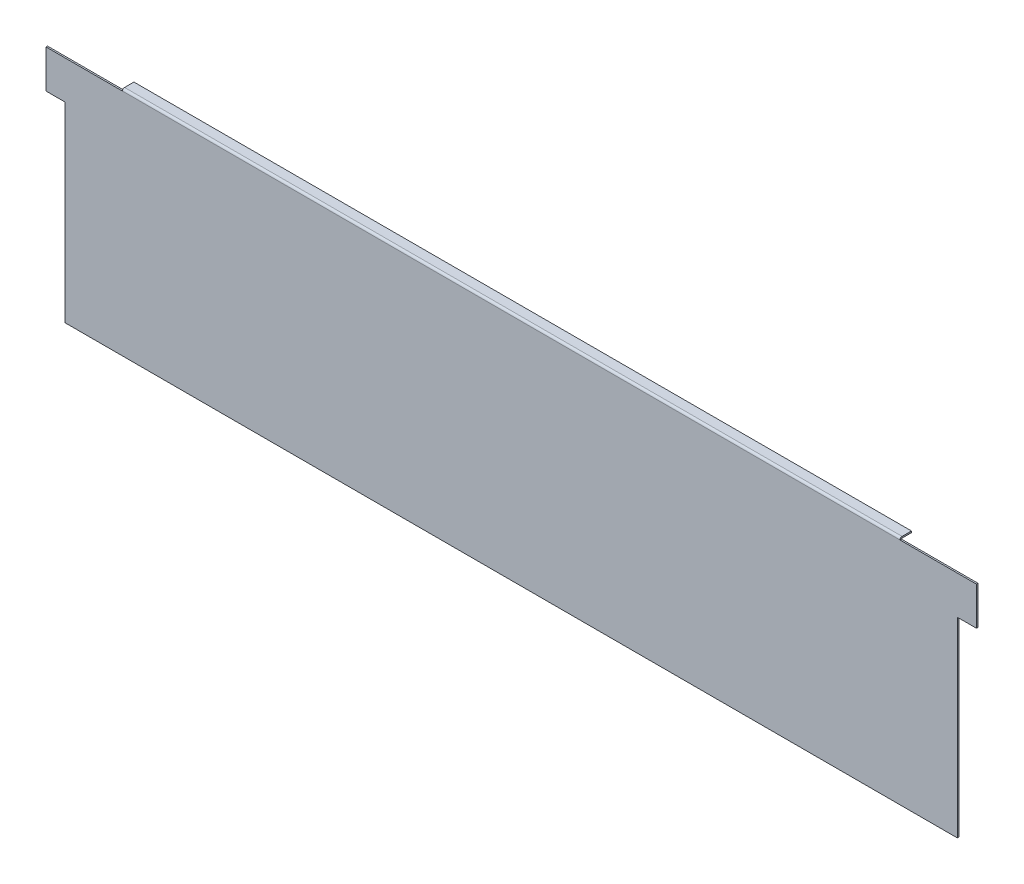
ISO-10303-21;
HEADER;
FILE_DESCRIPTION(('STEP AP214'),'2;1');
FILE_NAME('part.step','',(''),(''),'','','');
FILE_SCHEMA(('AUTOMOTIVE_DESIGN { 1 0 10303 214 1 1 1 1 }'));
ENDSEC;
DATA;
#1=APPLICATION_CONTEXT('core data for automotive mechanical design processes');
#2=APPLICATION_PROTOCOL_DEFINITION('international standard','automotive_design',2000,#1);
#3=PRODUCT_CONTEXT('',#1,'mechanical');
#4=PRODUCT('Part','Part','',(#3));
#5=PRODUCT_RELATED_PRODUCT_CATEGORY('part','',(#4));
#6=PRODUCT_DEFINITION_FORMATION('','',#4);
#7=PRODUCT_DEFINITION_CONTEXT('part definition',#1,'design');
#8=PRODUCT_DEFINITION('design','',#6,#7);
#9=PRODUCT_DEFINITION_SHAPE('','',#8);
#10=(LENGTH_UNIT() NAMED_UNIT(*) SI_UNIT(.MILLI.,.METRE.));
#11=(NAMED_UNIT(*) PLANE_ANGLE_UNIT() SI_UNIT($,.RADIAN.));
#12=(NAMED_UNIT(*) SI_UNIT($,.STERADIAN.) SOLID_ANGLE_UNIT());
#13=UNCERTAINTY_MEASURE_WITH_UNIT(LENGTH_MEASURE(1.E-05),#10,'distance_accuracy_value','');
#14=(GEOMETRIC_REPRESENTATION_CONTEXT(3) GLOBAL_UNCERTAINTY_ASSIGNED_CONTEXT((#13)) GLOBAL_UNIT_ASSIGNED_CONTEXT((#10,
#11,#12)) REPRESENTATION_CONTEXT('',''));
#15=CARTESIAN_POINT('',(0.,0.,0.));
#16=DIRECTION('',(0.,0.,1.));
#17=DIRECTION('',(1.,0.,0.));
#18=AXIS2_PLACEMENT_3D('',#15,#16,#17);
#19=CARTESIAN_POINT('',(-231.583191850594,141.455857385399,-2.));
#20=DIRECTION('',(0.,1.,0.));
#21=DIRECTION('',(0.,0.,1.));
#22=AXIS2_PLACEMENT_3D('',#19,#20,#21);
#23=PLANE('',#22);
#24=DIRECTION('',(-1.,0.,0.));
#25=VECTOR('',#24,1.);
#26=CARTESIAN_POINT('',(-231.583191850594,141.455857385399,-2.));
#27=LINE('',#26,#25);
#28=CARTESIAN_POINT('',(985.416808149406,141.455857385399,-2.));
#29=VERTEX_POINT('',#28);
#30=CARTESIAN_POINT('',(885.416808149406,141.455857385399,-1.99999999999996));
#31=VERTEX_POINT('',#30);
#32=EDGE_CURVE('E171',#29,#31,#27,.T.);
#33=ORIENTED_EDGE('',*,*,#32,.T.);
#34=DIRECTION('',(0.,0.,1.));
#35=VECTOR('',#34,1.);
#36=CARTESIAN_POINT('',(885.416808149406,141.455857385399,-1.99999999999996));
#37=LINE('',#36,#35);
#38=CARTESIAN_POINT('',(885.416808149406,141.455857385399,0.));
#39=VERTEX_POINT('',#38);
#40=EDGE_CURVE('E248',#31,#39,#37,.T.);
#41=ORIENTED_EDGE('',*,*,#40,.T.);
#42=DIRECTION('',(-1.,0.,0.));
#43=VECTOR('',#42,1.);
#44=CARTESIAN_POINT('',(-231.583191850594,141.455857385399,0.));
#45=LINE('',#44,#43);
#46=CARTESIAN_POINT('',(985.416808149406,141.455857385399,0.));
#47=VERTEX_POINT('',#46);
#48=EDGE_CURVE('E199',#47,#39,#45,.T.);
#49=ORIENTED_EDGE('',*,*,#48,.F.);
#50=DIRECTION('',(0.,0.,1.));
#51=VECTOR('',#50,1.);
#52=CARTESIAN_POINT('',(985.416808149406,141.455857385399,-2.));
#53=LINE('',#52,#51);
#54=EDGE_CURVE('E72',#29,#47,#53,.T.);
#55=ORIENTED_EDGE('',*,*,#54,.F.);
#56=EDGE_LOOP('',(#33,#41,#49,#55));
#57=FACE_BOUND('',#56,.T.);
#58=ADVANCED_FACE('F63',(#57),#23,.T.);
#59=CARTESIAN_POINT('',(-231.583191850594,141.455857385399,-2.));
#60=DIRECTION('',(-1.,0.,0.));
#61=DIRECTION('',(0.,-1.,0.));
#62=AXIS2_PLACEMENT_3D('',#59,#60,#61);
#63=PLANE('',#62);
#64=DIRECTION('',(0.,-1.,0.));
#65=VECTOR('',#64,1.);
#66=CARTESIAN_POINT('',(-231.583191850594,141.455857385399,0.));
#67=LINE('',#66,#65);
#68=CARTESIAN_POINT('',(-231.583191850594,141.455857385399,0.));
#69=VERTEX_POINT('',#68);
#70=CARTESIAN_POINT('',(-231.583191850594,91.4558573853989,0.));
#71=VERTEX_POINT('',#70);
#72=EDGE_CURVE('E181',#69,#71,#67,.T.);
#73=ORIENTED_EDGE('',*,*,#72,.F.);
#74=DIRECTION('',(0.,0.,1.));
#75=VECTOR('',#74,1.);
#76=CARTESIAN_POINT('',(-231.583191850594,141.455857385399,-2.));
#77=LINE('',#76,#75);
#78=CARTESIAN_POINT('',(-231.583191850594,141.455857385399,-2.));
#79=VERTEX_POINT('',#78);
#80=EDGE_CURVE('E13',#79,#69,#77,.T.);
#81=ORIENTED_EDGE('',*,*,#80,.F.);
#82=DIRECTION('',(0.,-1.,0.));
#83=VECTOR('',#82,1.);
#84=CARTESIAN_POINT('',(-231.583191850594,141.455857385399,-2.));
#85=LINE('',#84,#83);
#86=CARTESIAN_POINT('',(-231.583191850594,91.4558573853989,-2.));
#87=VERTEX_POINT('',#86);
#88=EDGE_CURVE('E201',#79,#87,#85,.T.);
#89=ORIENTED_EDGE('',*,*,#88,.T.);
#90=DIRECTION('',(0.,0.,1.));
#91=VECTOR('',#90,1.);
#92=CARTESIAN_POINT('',(-231.583191850594,91.4558573853989,-2.));
#93=LINE('',#92,#91);
#94=EDGE_CURVE('E67',#87,#71,#93,.T.);
#95=ORIENTED_EDGE('',*,*,#94,.T.);
#96=EDGE_LOOP('',(#73,#81,#89,#95));
#97=FACE_BOUND('',#96,.T.);
#98=ADVANCED_FACE('F65',(#97),#63,.T.);
#99=DIRECTION('',(0.,0.,1.));
#100=VECTOR('',#99,1.);
#101=CARTESIAN_POINT('',(-131.583191850594,141.455857385399,-1.99999999999996));
#102=LINE('',#101,#100);
#103=CARTESIAN_POINT('',(-131.583191850594,141.455857385399,-1.99999999999996));
#104=VERTEX_POINT('',#103);
#105=CARTESIAN_POINT('',(-131.583191850594,141.455857385399,0.));
#106=VERTEX_POINT('',#105);
#107=EDGE_CURVE('E184',#104,#106,#102,.T.);
#108=ORIENTED_EDGE('',*,*,#107,.F.);
#109=EDGE_CURVE('E88',#104,#79,#27,.T.);
#110=ORIENTED_EDGE('',*,*,#109,.T.);
#111=ORIENTED_EDGE('',*,*,#80,.T.);
#112=EDGE_CURVE('E123',#106,#69,#45,.T.);
#113=ORIENTED_EDGE('',*,*,#112,.F.);
#114=EDGE_LOOP('',(#108,#110,#111,#113));
#115=FACE_BOUND('',#114,.T.);
#116=ADVANCED_FACE('F229',(#115),#23,.T.);
#117=CARTESIAN_POINT('',(985.416808149406,141.455857385399,-2.));
#118=DIRECTION('',(1.,0.,0.));
#119=DIRECTION('',(0.,0.,-1.));
#120=AXIS2_PLACEMENT_3D('',#117,#118,#119);
#121=PLANE('',#120);
#122=DIRECTION('',(0.,1.,0.));
#123=VECTOR('',#122,1.);
#124=CARTESIAN_POINT('',(985.416808149406,141.455857385399,0.));
#125=LINE('',#124,#123);
#126=CARTESIAN_POINT('',(985.416808149406,91.4558573853989,0.));
#127=VERTEX_POINT('',#126);
#128=EDGE_CURVE('E155',#127,#47,#125,.T.);
#129=ORIENTED_EDGE('',*,*,#128,.F.);
#130=DIRECTION('',(0.,0.,1.));
#131=VECTOR('',#130,1.);
#132=CARTESIAN_POINT('',(985.416808149406,91.4558573853989,-2.));
#133=LINE('',#132,#131);
#134=CARTESIAN_POINT('',(985.416808149406,91.4558573853989,-2.));
#135=VERTEX_POINT('',#134);
#136=EDGE_CURVE('E149',#135,#127,#133,.T.);
#137=ORIENTED_EDGE('',*,*,#136,.F.);
#138=DIRECTION('',(0.,1.,0.));
#139=VECTOR('',#138,1.);
#140=CARTESIAN_POINT('',(985.416808149406,141.455857385399,-2.));
#141=LINE('',#140,#139);
#142=EDGE_CURVE('E152',#135,#29,#141,.T.);
#143=ORIENTED_EDGE('',*,*,#142,.T.);
#144=ORIENTED_EDGE('',*,*,#54,.T.);
#145=EDGE_LOOP('',(#129,#137,#143,#144));
#146=FACE_BOUND('',#145,.T.);
#147=ADVANCED_FACE('F151',(#146),#121,.T.);
#148=CARTESIAN_POINT('',(960.416808149406,91.4558573853989,-2.));
#149=DIRECTION('',(0.,-1.,0.));
#150=DIRECTION('',(0.,0.,-1.));
#151=AXIS2_PLACEMENT_3D('',#148,#149,#150);
#152=PLANE('',#151);
#153=DIRECTION('',(1.,0.,0.));
#154=VECTOR('',#153,1.);
#155=CARTESIAN_POINT('',(960.416808149406,91.4558573853989,0.));
#156=LINE('',#155,#154);
#157=CARTESIAN_POINT('',(960.416808149406,91.4558573853989,0.));
#158=VERTEX_POINT('',#157);
#159=EDGE_CURVE('E196',#158,#127,#156,.T.);
#160=ORIENTED_EDGE('',*,*,#159,.F.);
#161=DIRECTION('',(0.,0.,1.));
#162=VECTOR('',#161,1.);
#163=CARTESIAN_POINT('',(960.416808149406,91.4558573853989,-2.));
#164=LINE('',#163,#162);
#165=CARTESIAN_POINT('',(960.416808149406,91.4558573853989,-2.));
#166=VERTEX_POINT('',#165);
#167=EDGE_CURVE('E160',#166,#158,#164,.T.);
#168=ORIENTED_EDGE('',*,*,#167,.F.);
#169=DIRECTION('',(1.,0.,0.));
#170=VECTOR('',#169,1.);
#171=CARTESIAN_POINT('',(960.416808149406,91.4558573853989,-2.));
#172=LINE('',#171,#170);
#173=EDGE_CURVE('E167',#166,#135,#172,.T.);
#174=ORIENTED_EDGE('',*,*,#173,.T.);
#175=ORIENTED_EDGE('',*,*,#136,.T.);
#176=EDGE_LOOP('',(#160,#168,#174,#175));
#177=FACE_BOUND('',#176,.T.);
#178=ADVANCED_FACE('F173',(#177),#152,.T.);
#179=CARTESIAN_POINT('',(960.416808149406,91.4558573853989,-2.));
#180=DIRECTION('',(1.,0.,0.));
#181=DIRECTION('',(0.,1.,0.));
#182=AXIS2_PLACEMENT_3D('',#179,#180,#181);
#183=PLANE('',#182);
#184=DIRECTION('',(0.,1.,0.));
#185=VECTOR('',#184,1.);
#186=CARTESIAN_POINT('',(960.416808149406,91.4558573853989,0.));
#187=LINE('',#186,#185);
#188=CARTESIAN_POINT('',(960.416808149406,-158.544142614601,0.));
#189=VERTEX_POINT('',#188);
#190=EDGE_CURVE('E193',#189,#158,#187,.T.);
#191=ORIENTED_EDGE('',*,*,#190,.F.);
#192=DIRECTION('',(0.,0.,1.));
#193=VECTOR('',#192,1.);
#194=CARTESIAN_POINT('',(960.416808149406,-158.544142614601,-2.));
#195=LINE('',#194,#193);
#196=CARTESIAN_POINT('',(960.416808149406,-158.544142614601,-2.));
#197=VERTEX_POINT('',#196);
#198=EDGE_CURVE('E205',#197,#189,#195,.T.);
#199=ORIENTED_EDGE('',*,*,#198,.F.);
#200=DIRECTION('',(0.,1.,0.));
#201=VECTOR('',#200,1.);
#202=CARTESIAN_POINT('',(960.416808149406,91.4558573853989,-2.));
#203=LINE('',#202,#201);
#204=EDGE_CURVE('E174',#197,#166,#203,.T.);
#205=ORIENTED_EDGE('',*,*,#204,.T.);
#206=ORIENTED_EDGE('',*,*,#167,.T.);
#207=EDGE_LOOP('',(#191,#199,#205,#206));
#208=FACE_BOUND('',#207,.T.);
#209=ADVANCED_FACE('F268',(#208),#183,.T.);
#210=CARTESIAN_POINT('',(-206.583191850594,-158.544142614601,-2.));
#211=DIRECTION('',(0.,-1.,0.));
#212=DIRECTION('',(0.,0.,-1.));
#213=AXIS2_PLACEMENT_3D('',#210,#211,#212);
#214=PLANE('',#213);
#215=DIRECTION('',(1.,0.,0.));
#216=VECTOR('',#215,1.);
#217=CARTESIAN_POINT('',(-206.583191850594,-158.544142614601,0.));
#218=LINE('',#217,#216);
#219=CARTESIAN_POINT('',(-206.583191850594,-158.544142614601,0.));
#220=VERTEX_POINT('',#219);
#221=EDGE_CURVE('E190',#220,#189,#218,.T.);
#222=ORIENTED_EDGE('',*,*,#221,.F.);
#223=DIRECTION('',(0.,0.,1.));
#224=VECTOR('',#223,1.);
#225=CARTESIAN_POINT('',(-206.583191850594,-158.544142614601,-2.));
#226=LINE('',#225,#224);
#227=CARTESIAN_POINT('',(-206.583191850594,-158.544142614601,-2.));
#228=VERTEX_POINT('',#227);
#229=EDGE_CURVE('E207',#228,#220,#226,.T.);
#230=ORIENTED_EDGE('',*,*,#229,.F.);
#231=DIRECTION('',(1.,0.,0.));
#232=VECTOR('',#231,1.);
#233=CARTESIAN_POINT('',(-206.583191850594,-158.544142614601,-2.));
#234=LINE('',#233,#232);
#235=EDGE_CURVE('E176',#228,#197,#234,.T.);
#236=ORIENTED_EDGE('',*,*,#235,.T.);
#237=ORIENTED_EDGE('',*,*,#198,.T.);
#238=EDGE_LOOP('',(#222,#230,#236,#237));
#239=FACE_BOUND('',#238,.T.);
#240=ADVANCED_FACE('F263',(#239),#214,.T.);
#241=CARTESIAN_POINT('',(-206.583191850594,91.4558573853989,-2.));
#242=DIRECTION('',(-1.,0.,0.));
#243=DIRECTION('',(0.,-1.,0.));
#244=AXIS2_PLACEMENT_3D('',#241,#242,#243);
#245=PLANE('',#244);
#246=DIRECTION('',(0.,-1.,0.));
#247=VECTOR('',#246,1.);
#248=CARTESIAN_POINT('',(-206.583191850594,91.4558573853989,0.));
#249=LINE('',#248,#247);
#250=CARTESIAN_POINT('',(-206.583191850594,91.4558573853989,0.));
#251=VERTEX_POINT('',#250);
#252=EDGE_CURVE('E187',#251,#220,#249,.T.);
#253=ORIENTED_EDGE('',*,*,#252,.F.);
#254=DIRECTION('',(0.,0.,1.));
#255=VECTOR('',#254,1.);
#256=CARTESIAN_POINT('',(-206.583191850594,91.4558573853989,-2.));
#257=LINE('',#256,#255);
#258=CARTESIAN_POINT('',(-206.583191850594,91.4558573853989,-2.));
#259=VERTEX_POINT('',#258);
#260=EDGE_CURVE('E208',#259,#251,#257,.T.);
#261=ORIENTED_EDGE('',*,*,#260,.F.);
#262=DIRECTION('',(0.,-1.,0.));
#263=VECTOR('',#262,1.);
#264=CARTESIAN_POINT('',(-206.583191850594,91.4558573853989,-2.));
#265=LINE('',#264,#263);
#266=EDGE_CURVE('E254',#259,#228,#265,.T.);
#267=ORIENTED_EDGE('',*,*,#266,.T.);
#268=ORIENTED_EDGE('',*,*,#229,.T.);
#269=EDGE_LOOP('',(#253,#261,#267,#268));
#270=FACE_BOUND('',#269,.T.);
#271=ADVANCED_FACE('F266',(#270),#245,.T.);
#272=CARTESIAN_POINT('',(-231.583191850594,91.4558573853989,-2.));
#273=DIRECTION('',(0.,-1.,0.));
#274=DIRECTION('',(0.,0.,-1.));
#275=AXIS2_PLACEMENT_3D('',#272,#273,#274);
#276=PLANE('',#275);
#277=DIRECTION('',(1.,0.,0.));
#278=VECTOR('',#277,1.);
#279=CARTESIAN_POINT('',(-231.583191850594,91.4558573853989,0.));
#280=LINE('',#279,#278);
#281=EDGE_CURVE('E183',#71,#251,#280,.T.);
#282=ORIENTED_EDGE('',*,*,#281,.F.);
#283=ORIENTED_EDGE('',*,*,#94,.F.);
#284=DIRECTION('',(1.,0.,0.));
#285=VECTOR('',#284,1.);
#286=CARTESIAN_POINT('',(-231.583191850594,91.4558573853989,-2.));
#287=LINE('',#286,#285);
#288=EDGE_CURVE('E252',#87,#259,#287,.T.);
#289=ORIENTED_EDGE('',*,*,#288,.T.);
#290=ORIENTED_EDGE('',*,*,#260,.T.);
#291=EDGE_LOOP('',(#282,#283,#289,#290));
#292=FACE_BOUND('',#291,.T.);
#293=ADVANCED_FACE('F213',(#292),#276,.T.);
#294=CARTESIAN_POINT('',(0.,0.,-2.));
#295=DIRECTION('',(0.,0.,1.));
#296=DIRECTION('',(1.,0.,0.));
#297=AXIS2_PLACEMENT_3D('',#294,#295,#296);
#298=PLANE('',#297);
#299=ORIENTED_EDGE('',*,*,#88,.F.);
#300=ORIENTED_EDGE('',*,*,#109,.F.);
#301=DIRECTION('',(1.,0.,0.));
#302=VECTOR('',#301,1.);
#303=CARTESIAN_POINT('',(885.416808149406,141.455857385399,-1.99999999999996));
#304=LINE('',#303,#302);
#305=EDGE_CURVE('E250',#31,#104,#304,.F.);
#306=ORIENTED_EDGE('',*,*,#305,.F.);
#307=ORIENTED_EDGE('',*,*,#32,.F.);
#308=ORIENTED_EDGE('',*,*,#142,.F.);
#309=ORIENTED_EDGE('',*,*,#173,.F.);
#310=ORIENTED_EDGE('',*,*,#204,.F.);
#311=ORIENTED_EDGE('',*,*,#235,.F.);
#312=ORIENTED_EDGE('',*,*,#266,.F.);
#313=ORIENTED_EDGE('',*,*,#288,.F.);
#314=EDGE_LOOP('',(#299,#300,#306,#307,#308,#309,#310,#311,#312,#313));
#315=FACE_BOUND('',#314,.T.);
#316=ADVANCED_FACE('F165',(#315),#298,.F.);
#317=CARTESIAN_POINT('',(0.,0.,0.));
#318=DIRECTION('',(0.,0.,1.));
#319=DIRECTION('',(1.,0.,0.));
#320=AXIS2_PLACEMENT_3D('',#317,#318,#319);
#321=PLANE('',#320);
#322=ORIENTED_EDGE('',*,*,#72,.T.);
#323=ORIENTED_EDGE('',*,*,#281,.T.);
#324=ORIENTED_EDGE('',*,*,#252,.T.);
#325=ORIENTED_EDGE('',*,*,#221,.T.);
#326=ORIENTED_EDGE('',*,*,#190,.T.);
#327=ORIENTED_EDGE('',*,*,#159,.T.);
#328=ORIENTED_EDGE('',*,*,#128,.T.);
#329=ORIENTED_EDGE('',*,*,#48,.T.);
#330=DIRECTION('',(1.,0.,0.));
#331=VECTOR('',#330,1.);
#332=CARTESIAN_POINT('',(885.416808149406,141.455857385399,0.));
#333=LINE('',#332,#331);
#334=EDGE_CURVE('E508',#39,#106,#333,.F.);
#335=ORIENTED_EDGE('',*,*,#334,.T.);
#336=ORIENTED_EDGE('',*,*,#112,.T.);
#337=EDGE_LOOP('',(#322,#323,#324,#325,#326,#327,#328,#329,#335,#336));
#338=FACE_BOUND('',#337,.T.);
#339=ADVANCED_FACE('F214',(#338),#321,.T.);
#340=CARTESIAN_POINT('',(-131.583191850594,141.455857385399,-2.73659999999997));
#341=DIRECTION('',(-1.,0.,0.));
#342=DIRECTION('',(0.,0.,1.));
#343=AXIS2_PLACEMENT_3D('',#340,#341,#342);
#344=PLANE('',#343);
#345=DIRECTION('',(0.,-1.,0.));
#346=VECTOR('',#345,1.);
#347=CARTESIAN_POINT('',(-131.583191850594,144.192457385399,-2.73659999999991));
#348=LINE('',#347,#346);
#349=CARTESIAN_POINT('',(-131.583191850594,142.192457385399,-2.73659999999996));
#350=VERTEX_POINT('',#349);
#351=CARTESIAN_POINT('',(-131.583191850594,144.192457385399,-2.73659999999996));
#352=VERTEX_POINT('',#351);
#353=EDGE_CURVE('E506',#350,#352,#348,.F.);
#354=ORIENTED_EDGE('',*,*,#353,.F.);
#355=CARTESIAN_POINT('',(-131.583191850594,141.455857385399,-2.73659999999997));
#356=DIRECTION('',(1.,0.,0.));
#357=DIRECTION('',(0.,0.,-1.));
#358=AXIS2_PLACEMENT_3D('',#355,#356,#357);
#359=CIRCLE('',#358,0.736600000000004);
#360=EDGE_CURVE('E513',#104,#350,#359,.F.);
#361=ORIENTED_EDGE('',*,*,#360,.F.);
#362=ORIENTED_EDGE('',*,*,#107,.T.);
#363=CARTESIAN_POINT('',(-131.583191850594,141.455857385399,-2.73659999999997));
#364=DIRECTION('',(1.,0.,0.));
#365=DIRECTION('',(0.,0.,-1.));
#366=AXIS2_PLACEMENT_3D('',#363,#364,#365);
#367=CIRCLE('',#366,2.7366);
#368=EDGE_CURVE('E510',#106,#352,#367,.F.);
#369=ORIENTED_EDGE('',*,*,#368,.T.);
#370=EDGE_LOOP('',(#354,#361,#362,#369));
#371=FACE_BOUND('',#370,.T.);
#372=ADVANCED_FACE('F216',(#371),#344,.T.);
#373=CARTESIAN_POINT('',(885.416808149406,141.455857385399,-2.73659999999997));
#374=DIRECTION('',(-1.,0.,0.));
#375=DIRECTION('',(0.,0.,1.));
#376=AXIS2_PLACEMENT_3D('',#373,#374,#375);
#377=PLANE('',#376);
#378=CARTESIAN_POINT('',(885.416808149406,141.455857385399,-2.73659999999997));
#379=DIRECTION('',(1.,0.,0.));
#380=DIRECTION('',(0.,0.,-1.));
#381=AXIS2_PLACEMENT_3D('',#378,#379,#380);
#382=CIRCLE('',#381,0.736600000000004);
#383=CARTESIAN_POINT('',(885.416808149406,142.192457385399,-2.73659999999996));
#384=VERTEX_POINT('',#383);
#385=EDGE_CURVE('E517',#384,#31,#382,.T.);
#386=ORIENTED_EDGE('',*,*,#385,.F.);
#387=DIRECTION('',(0.,-1.,0.));
#388=VECTOR('',#387,1.);
#389=CARTESIAN_POINT('',(885.416808149406,142.192457385399,-2.73660000000001));
#390=LINE('',#389,#388);
#391=CARTESIAN_POINT('',(885.416808149406,144.192457385399,-2.7366));
#392=VERTEX_POINT('',#391);
#393=EDGE_CURVE('E503',#384,#392,#390,.F.);
#394=ORIENTED_EDGE('',*,*,#393,.T.);
#395=CARTESIAN_POINT('',(885.416808149406,141.455857385399,-2.73659999999997));
#396=DIRECTION('',(1.,0.,0.));
#397=DIRECTION('',(0.,0.,-1.));
#398=AXIS2_PLACEMENT_3D('',#395,#396,#397);
#399=CIRCLE('',#398,2.7366);
#400=EDGE_CURVE('E80',#392,#39,#399,.T.);
#401=ORIENTED_EDGE('',*,*,#400,.T.);
#402=ORIENTED_EDGE('',*,*,#40,.F.);
#403=EDGE_LOOP('',(#386,#394,#401,#402));
#404=FACE_BOUND('',#403,.T.);
#405=ADVANCED_FACE('F222',(#404),#377,.F.);
#406=CARTESIAN_POINT('',(885.416808149406,141.455857385399,-2.73659999999997));
#407=DIRECTION('',(1.,0.,0.));
#408=DIRECTION('',(0.,1.,0.));
#409=AXIS2_PLACEMENT_3D('',#406,#407,#408);
#410=CYLINDRICAL_SURFACE('',#409,2.7366);
#411=ORIENTED_EDGE('',*,*,#334,.F.);
#412=ORIENTED_EDGE('',*,*,#400,.F.);
#413=DIRECTION('',(1.,0.,0.));
#414=VECTOR('',#413,1.);
#415=CARTESIAN_POINT('',(-131.583191850594,144.192457385399,-2.73659999999991));
#416=LINE('',#415,#414);
#417=EDGE_CURVE('E500',#392,#352,#416,.F.);
#418=ORIENTED_EDGE('',*,*,#417,.T.);
#419=ORIENTED_EDGE('',*,*,#368,.F.);
#420=EDGE_LOOP('',(#411,#412,#418,#419));
#421=FACE_BOUND('',#420,.T.);
#422=ADVANCED_FACE('F362',(#421),#410,.T.);
#423=CARTESIAN_POINT('',(885.416808149406,141.455857385399,-2.73659999999997));
#424=DIRECTION('',(1.,0.,0.));
#425=DIRECTION('',(0.,1.,0.));
#426=AXIS2_PLACEMENT_3D('',#423,#424,#425);
#427=CYLINDRICAL_SURFACE('',#426,0.736600000000004);
#428=ORIENTED_EDGE('',*,*,#305,.T.);
#429=ORIENTED_EDGE('',*,*,#360,.T.);
#430=DIRECTION('',(1.,0.,0.));
#431=VECTOR('',#430,1.);
#432=CARTESIAN_POINT('',(-131.583191850594,142.192457385399,-2.73659999999992));
#433=LINE('',#432,#431);
#434=EDGE_CURVE('E490',#350,#384,#433,.T.);
#435=ORIENTED_EDGE('',*,*,#434,.T.);
#436=ORIENTED_EDGE('',*,*,#385,.T.);
#437=EDGE_LOOP('',(#428,#429,#435,#436));
#438=FACE_BOUND('',#437,.T.);
#439=ADVANCED_FACE('F370',(#438),#427,.F.);
#440=CARTESIAN_POINT('',(885.416808149406,144.192457385399,-15.));
#441=DIRECTION('',(-1.,0.,0.));
#442=DIRECTION('',(0.,0.,1.));
#443=AXIS2_PLACEMENT_3D('',#440,#441,#442);
#444=PLANE('',#443);
#445=ORIENTED_EDGE('',*,*,#393,.F.);
#446=DIRECTION('',(0.,0.,1.));
#447=VECTOR('',#446,1.);
#448=CARTESIAN_POINT('',(885.416808149406,142.192457385399,-15.));
#449=LINE('',#448,#447);
#450=CARTESIAN_POINT('',(885.416808149406,142.192457385399,-15.));
#451=VERTEX_POINT('',#450);
#452=EDGE_CURVE('E480',#384,#451,#449,.F.);
#453=ORIENTED_EDGE('',*,*,#452,.T.);
#454=DIRECTION('',(0.,-1.,0.));
#455=VECTOR('',#454,1.);
#456=CARTESIAN_POINT('',(885.416808149406,144.192457385399,-15.));
#457=LINE('',#456,#455);
#458=CARTESIAN_POINT('',(885.416808149406,144.192457385399,-15.));
#459=VERTEX_POINT('',#458);
#460=EDGE_CURVE('E474',#459,#451,#457,.T.);
#461=ORIENTED_EDGE('',*,*,#460,.F.);
#462=DIRECTION('',(0.,0.,-1.));
#463=VECTOR('',#462,1.);
#464=CARTESIAN_POINT('',(885.416808149406,144.192457385399,6.11012000513692E-13));
#465=LINE('',#464,#463);
#466=EDGE_CURVE('E491',#392,#459,#465,.T.);
#467=ORIENTED_EDGE('',*,*,#466,.F.);
#468=EDGE_LOOP('',(#445,#453,#461,#467));
#469=FACE_BOUND('',#468,.T.);
#470=ADVANCED_FACE('F379',(#469),#444,.F.);
#471=CARTESIAN_POINT('',(-131.583191850594,144.192457385399,-1.99999999999992));
#472=DIRECTION('',(1.,0.,0.));
#473=DIRECTION('',(0.,0.,-1.));
#474=AXIS2_PLACEMENT_3D('',#471,#472,#473);
#475=PLANE('',#474);
#476=ORIENTED_EDGE('',*,*,#353,.T.);
#477=DIRECTION('',(0.,0.,1.));
#478=VECTOR('',#477,1.);
#479=CARTESIAN_POINT('',(-131.583191850594,144.192457385399,0.));
#480=LINE('',#479,#478);
#481=CARTESIAN_POINT('',(-131.583191850594,144.192457385399,-15.));
#482=VERTEX_POINT('',#481);
#483=EDGE_CURVE('E486',#482,#352,#480,.T.);
#484=ORIENTED_EDGE('',*,*,#483,.F.);
#485=DIRECTION('',(0.,-1.,0.));
#486=VECTOR('',#485,1.);
#487=CARTESIAN_POINT('',(-131.583191850594,144.192457385399,-15.));
#488=LINE('',#487,#486);
#489=CARTESIAN_POINT('',(-131.583191850594,142.192457385399,-15.));
#490=VERTEX_POINT('',#489);
#491=EDGE_CURVE('E470',#482,#490,#488,.T.);
#492=ORIENTED_EDGE('',*,*,#491,.T.);
#493=DIRECTION('',(0.,0.,-1.));
#494=VECTOR('',#493,1.);
#495=CARTESIAN_POINT('',(-131.583191850594,142.192457385399,-1.99999999999993));
#496=LINE('',#495,#494);
#497=EDGE_CURVE('E479',#490,#350,#496,.F.);
#498=ORIENTED_EDGE('',*,*,#497,.T.);
#499=EDGE_LOOP('',(#476,#484,#492,#498));
#500=FACE_BOUND('',#499,.T.);
#501=ADVANCED_FACE('F388',(#500),#475,.F.);
#502=CARTESIAN_POINT('',(0.,144.192457385399,6.11012000513692E-13));
#503=DIRECTION('',(0.,-1.,0.));
#504=DIRECTION('',(0.,0.,-1.));
#505=AXIS2_PLACEMENT_3D('',#502,#503,#504);
#506=PLANE('',#505);
#507=ORIENTED_EDGE('',*,*,#417,.F.);
#508=ORIENTED_EDGE('',*,*,#466,.T.);
#509=DIRECTION('',(-1.,0.,0.));
#510=VECTOR('',#509,1.);
#511=CARTESIAN_POINT('',(0.,144.192457385399,-15.));
#512=LINE('',#511,#510);
#513=EDGE_CURVE('E494',#459,#482,#512,.T.);
#514=ORIENTED_EDGE('',*,*,#513,.T.);
#515=ORIENTED_EDGE('',*,*,#483,.T.);
#516=EDGE_LOOP('',(#507,#508,#514,#515));
#517=FACE_BOUND('',#516,.T.);
#518=ADVANCED_FACE('F397',(#517),#506,.F.);
#519=CARTESIAN_POINT('',(0.,142.192457385399,6.04029037836005E-13));
#520=DIRECTION('',(0.,-1.,0.));
#521=DIRECTION('',(0.,0.,-1.));
#522=AXIS2_PLACEMENT_3D('',#519,#520,#521);
#523=PLANE('',#522);
#524=ORIENTED_EDGE('',*,*,#452,.F.);
#525=ORIENTED_EDGE('',*,*,#434,.F.);
#526=ORIENTED_EDGE('',*,*,#497,.F.);
#527=DIRECTION('',(1.,0.,0.));
#528=VECTOR('',#527,1.);
#529=CARTESIAN_POINT('',(-131.583191850594,142.192457385399,-15.));
#530=LINE('',#529,#528);
#531=EDGE_CURVE('E466',#451,#490,#530,.F.);
#532=ORIENTED_EDGE('',*,*,#531,.F.);
#533=EDGE_LOOP('',(#524,#525,#526,#532));
#534=FACE_BOUND('',#533,.T.);
#535=ADVANCED_FACE('F406',(#534),#523,.T.);
#536=CARTESIAN_POINT('',(-131.583191850594,144.192457385399,-15.));
#537=DIRECTION('',(0.,0.,1.));
#538=DIRECTION('',(0.,-1.,0.));
#539=AXIS2_PLACEMENT_3D('',#536,#537,#538);
#540=PLANE('',#539);
#541=ORIENTED_EDGE('',*,*,#531,.T.);
#542=ORIENTED_EDGE('',*,*,#491,.F.);
#543=ORIENTED_EDGE('',*,*,#513,.F.);
#544=ORIENTED_EDGE('',*,*,#460,.T.);
#545=EDGE_LOOP('',(#541,#542,#543,#544));
#546=FACE_BOUND('',#545,.T.);
#547=ADVANCED_FACE('F415',(#546),#540,.F.);
#548=CLOSED_SHELL('',(#58,#98,#116,#147,#178,#209,#240,#271,#293,#316,#339,#372,#405,#422,#439,
#470,#501,#518,#535,#547));
#549=MANIFOLD_SOLID_BREP('B2',#548);
#550=ADVANCED_BREP_SHAPE_REPRESENTATION('',(#18,#549),#14);
#551=SHAPE_DEFINITION_REPRESENTATION(#9,#550);
ENDSEC;
END-ISO-10303-21;
